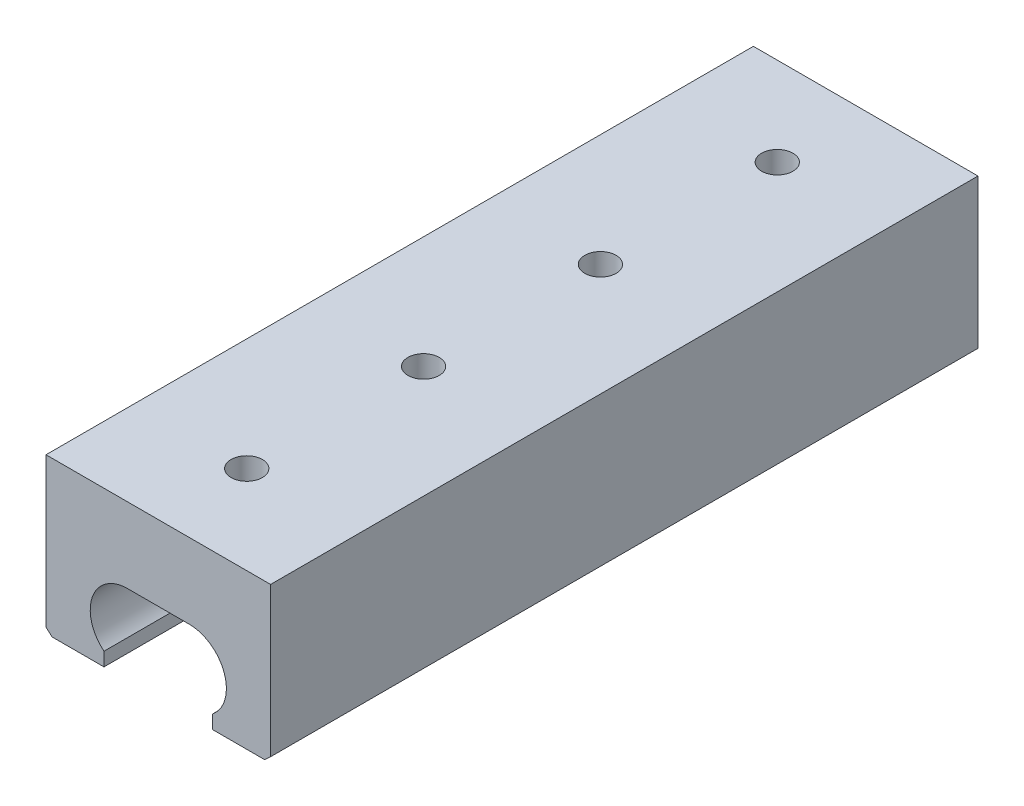
ISO-10303-21;
HEADER;
FILE_DESCRIPTION(('STEP AP214'),'2;1');
FILE_NAME('part.step','',(''),(''),'','','');
FILE_SCHEMA(('AUTOMOTIVE_DESIGN { 1 0 10303 214 1 1 1 1 }'));
ENDSEC;
DATA;
#1=APPLICATION_CONTEXT('core data for automotive mechanical design processes');
#2=APPLICATION_PROTOCOL_DEFINITION('international standard','automotive_design',2000,#1);
#3=PRODUCT_CONTEXT('',#1,'mechanical');
#4=PRODUCT('Part','Part','',(#3));
#5=PRODUCT_RELATED_PRODUCT_CATEGORY('part','',(#4));
#6=PRODUCT_DEFINITION_FORMATION('','',#4);
#7=PRODUCT_DEFINITION_CONTEXT('part definition',#1,'design');
#8=PRODUCT_DEFINITION('design','',#6,#7);
#9=PRODUCT_DEFINITION_SHAPE('','',#8);
#10=(LENGTH_UNIT() NAMED_UNIT(*) SI_UNIT(.MILLI.,.METRE.));
#11=(NAMED_UNIT(*) PLANE_ANGLE_UNIT() SI_UNIT($,.RADIAN.));
#12=(NAMED_UNIT(*) SI_UNIT($,.STERADIAN.) SOLID_ANGLE_UNIT());
#13=UNCERTAINTY_MEASURE_WITH_UNIT(LENGTH_MEASURE(1.E-05),#10,'distance_accuracy_value','');
#14=(GEOMETRIC_REPRESENTATION_CONTEXT(3) GLOBAL_UNCERTAINTY_ASSIGNED_CONTEXT((#13)) GLOBAL_UNIT_ASSIGNED_CONTEXT((#10,
#11,#12)) REPRESENTATION_CONTEXT('',''));
#15=CARTESIAN_POINT('',(0.,0.,0.));
#16=DIRECTION('',(0.,0.,1.));
#17=DIRECTION('',(1.,0.,0.));
#18=AXIS2_PLACEMENT_3D('',#15,#16,#17);
#19=CARTESIAN_POINT('',(-68.5063828996091,11.5130335390309,203.2));
#20=DIRECTION('',(1.,0.,0.));
#21=DIRECTION('',(0.,0.,-1.));
#22=AXIS2_PLACEMENT_3D('',#19,#20,#21);
#23=PLANE('',#22);
#24=DIRECTION('',(0.,-1.,0.));
#25=VECTOR('',#24,1.);
#26=CARTESIAN_POINT('',(-68.5063828996091,11.5130335390309,0.));
#27=LINE('',#26,#25);
#28=CARTESIAN_POINT('',(-68.5063828996091,11.5130335390309,0.));
#29=VERTEX_POINT('',#28);
#30=CARTESIAN_POINT('',(-68.5063828996091,-31.3555147627907,0.));
#31=VERTEX_POINT('',#30);
#32=EDGE_CURVE('E171',#29,#31,#27,.T.);
#33=ORIENTED_EDGE('',*,*,#32,.T.);
#34=DIRECTION('',(0.,0.,-1.));
#35=VECTOR('',#34,1.);
#36=CARTESIAN_POINT('',(-68.5063828996091,-31.3555147627907,203.2));
#37=LINE('',#36,#35);
#38=CARTESIAN_POINT('',(-68.5063828996091,-31.3555147627907,203.2));
#39=VERTEX_POINT('',#38);
#40=EDGE_CURVE('E237',#39,#31,#37,.T.);
#41=ORIENTED_EDGE('',*,*,#40,.F.);
#42=DIRECTION('',(0.,-1.,0.));
#43=VECTOR('',#42,1.);
#44=CARTESIAN_POINT('',(-68.5063828996091,11.5130335390309,203.2));
#45=LINE('',#44,#43);
#46=CARTESIAN_POINT('',(-68.5063828996091,11.5130335390309,203.2));
#47=VERTEX_POINT('',#46);
#48=EDGE_CURVE('E204',#47,#39,#45,.T.);
#49=ORIENTED_EDGE('',*,*,#48,.F.);
#50=DIRECTION('',(0.,0.,-1.));
#51=VECTOR('',#50,1.);
#52=CARTESIAN_POINT('',(-68.5063828996091,11.5130335390309,203.2));
#53=LINE('',#52,#51);
#54=EDGE_CURVE('E170',#47,#29,#53,.T.);
#55=ORIENTED_EDGE('',*,*,#54,.T.);
#56=EDGE_LOOP('',(#33,#41,#49,#55));
#57=FACE_BOUND('',#56,.T.);
#58=ADVANCED_FACE('F41',(#57),#23,.F.);
#59=CARTESIAN_POINT('',(-68.5063828996091,-31.3555147627907,203.2));
#60=DIRECTION('',(0.679560356484189,0.733619602992643,0.));
#61=DIRECTION('',(-0.733619602992643,0.679560356484189,0.));
#62=AXIS2_PLACEMENT_3D('',#59,#60,#61);
#63=PLANE('',#62);
#64=DIRECTION('',(0.733619602992643,-0.679560356484189,0.));
#65=VECTOR('',#64,1.);
#66=CARTESIAN_POINT('',(-68.5063828996091,-31.3555147627907,0.));
#67=LINE('',#66,#65);
#68=CARTESIAN_POINT('',(-66.7991262065142,-32.9369664609691,0.));
#69=VERTEX_POINT('',#68);
#70=EDGE_CURVE('E174',#31,#69,#67,.T.);
#71=ORIENTED_EDGE('',*,*,#70,.T.);
#72=DIRECTION('',(0.,0.,-1.));
#73=VECTOR('',#72,1.);
#74=CARTESIAN_POINT('',(-66.7991262065142,-32.9369664609691,203.2));
#75=LINE('',#74,#73);
#76=CARTESIAN_POINT('',(-66.7991262065142,-32.9369664609691,203.2));
#77=VERTEX_POINT('',#76);
#78=EDGE_CURVE('E232',#77,#69,#75,.T.);
#79=ORIENTED_EDGE('',*,*,#78,.F.);
#80=DIRECTION('',(0.733619602992643,-0.679560356484189,0.));
#81=VECTOR('',#80,1.);
#82=CARTESIAN_POINT('',(-68.5063828996091,-31.3555147627907,203.2));
#83=LINE('',#82,#81);
#84=EDGE_CURVE('E114',#39,#77,#83,.T.);
#85=ORIENTED_EDGE('',*,*,#84,.F.);
#86=ORIENTED_EDGE('',*,*,#40,.T.);
#87=EDGE_LOOP('',(#71,#79,#85,#86));
#88=FACE_BOUND('',#87,.T.);
#89=ADVANCED_FACE('F271',(#88),#63,.F.);
#90=CARTESIAN_POINT('',(-51.8484095418568,-32.9369664609691,203.2));
#91=DIRECTION('',(0.,1.,0.));
#92=DIRECTION('',(0.,0.,1.));
#93=AXIS2_PLACEMENT_3D('',#90,#91,#92);
#94=PLANE('',#93);
#95=DIRECTION('',(1.,0.,0.));
#96=VECTOR('',#95,1.);
#97=CARTESIAN_POINT('',(-51.8484095418568,-32.9369664609691,0.));
#98=LINE('',#97,#96);
#99=CARTESIAN_POINT('',(-51.8484095418568,-32.9369664609691,0.));
#100=VERTEX_POINT('',#99);
#101=EDGE_CURVE('E177',#69,#100,#98,.T.);
#102=ORIENTED_EDGE('',*,*,#101,.T.);
#103=DIRECTION('',(0.,0.,-1.));
#104=VECTOR('',#103,1.);
#105=CARTESIAN_POINT('',(-51.8484095418568,-32.9369664609691,203.2));
#106=LINE('',#105,#104);
#107=CARTESIAN_POINT('',(-51.8484095418568,-32.9369664609691,203.2));
#108=VERTEX_POINT('',#107);
#109=EDGE_CURVE('E233',#108,#100,#106,.T.);
#110=ORIENTED_EDGE('',*,*,#109,.F.);
#111=DIRECTION('',(1.,0.,0.));
#112=VECTOR('',#111,1.);
#113=CARTESIAN_POINT('',(-51.8484095418568,-32.9369664609691,203.2));
#114=LINE('',#113,#112);
#115=EDGE_CURVE('E386',#77,#108,#114,.T.);
#116=ORIENTED_EDGE('',*,*,#115,.F.);
#117=ORIENTED_EDGE('',*,*,#78,.T.);
#118=EDGE_LOOP('',(#102,#110,#116,#117));
#119=FACE_BOUND('',#118,.T.);
#120=ADVANCED_FACE('F278',(#119),#94,.F.);
#121=CARTESIAN_POINT('',(-51.8484095418568,-29.0298593773015,203.2));
#122=DIRECTION('',(-1.,0.,0.));
#123=DIRECTION('',(0.,-1.,0.));
#124=AXIS2_PLACEMENT_3D('',#121,#122,#123);
#125=PLANE('',#124);
#126=DIRECTION('',(0.,1.,0.));
#127=VECTOR('',#126,1.);
#128=CARTESIAN_POINT('',(-51.8484095418568,-29.0298593773015,0.));
#129=LINE('',#128,#127);
#130=CARTESIAN_POINT('',(-51.8484095418568,-29.0298593773015,0.));
#131=VERTEX_POINT('',#130);
#132=EDGE_CURVE('E185',#100,#131,#129,.T.);
#133=ORIENTED_EDGE('',*,*,#132,.T.);
#134=DIRECTION('',(0.,0.,-1.));
#135=VECTOR('',#134,1.);
#136=CARTESIAN_POINT('',(-51.8484095418568,-29.0298593773015,203.2));
#137=LINE('',#136,#135);
#138=CARTESIAN_POINT('',(-51.8484095418568,-29.0298593773015,203.2));
#139=VERTEX_POINT('',#138);
#140=EDGE_CURVE('E227',#139,#131,#137,.T.);
#141=ORIENTED_EDGE('',*,*,#140,.F.);
#142=DIRECTION('',(0.,1.,0.));
#143=VECTOR('',#142,1.);
#144=CARTESIAN_POINT('',(-51.8484095418568,-29.0298593773015,203.2));
#145=LINE('',#144,#143);
#146=EDGE_CURVE('E333',#108,#139,#145,.T.);
#147=ORIENTED_EDGE('',*,*,#146,.F.);
#148=ORIENTED_EDGE('',*,*,#109,.T.);
#149=EDGE_LOOP('',(#133,#141,#147,#148));
#150=FACE_BOUND('',#149,.T.);
#151=ADVANCED_FACE('F311',(#150),#125,.F.);
#152=CARTESIAN_POINT('',(-45.1383828996091,-20.7363820330069,203.2));
#153=DIRECTION('',(0.,0.,-1.));
#154=DIRECTION('',(-1.,0.,0.));
#155=AXIS2_PLACEMENT_3D('',#152,#153,#154);
#156=CYLINDRICAL_SURFACE('',#155,10.668);
#157=CARTESIAN_POINT('',(-45.1383828996091,-20.7363820330069,0.));
#158=DIRECTION('',(0.,0.,-1.));
#159=DIRECTION('',(1.,0.,0.));
#160=AXIS2_PLACEMENT_3D('',#157,#158,#159);
#161=CIRCLE('',#160,10.668);
#162=CARTESIAN_POINT('',(-45.1383828996091,-10.068382033007,0.));
#163=VERTEX_POINT('',#162);
#164=EDGE_CURVE('E184',#131,#163,#161,.T.);
#165=ORIENTED_EDGE('',*,*,#164,.T.);
#166=DIRECTION('',(0.,0.,-1.));
#167=VECTOR('',#166,1.);
#168=CARTESIAN_POINT('',(-45.1383828996091,-10.068382033007,203.2));
#169=LINE('',#168,#167);
#170=CARTESIAN_POINT('',(-45.1383828996091,-10.068382033007,203.2));
#171=VERTEX_POINT('',#170);
#172=EDGE_CURVE('E221',#171,#163,#169,.T.);
#173=ORIENTED_EDGE('',*,*,#172,.F.);
#174=CARTESIAN_POINT('',(-45.1383828996091,-20.7363820330069,203.2));
#175=DIRECTION('',(0.,0.,-1.));
#176=DIRECTION('',(1.,0.,0.));
#177=AXIS2_PLACEMENT_3D('',#174,#175,#176);
#178=CIRCLE('',#177,10.668);
#179=EDGE_CURVE('E345',#139,#171,#178,.T.);
#180=ORIENTED_EDGE('',*,*,#179,.F.);
#181=ORIENTED_EDGE('',*,*,#140,.T.);
#182=EDGE_LOOP('',(#165,#173,#180,#181));
#183=FACE_BOUND('',#182,.T.);
#184=ADVANCED_FACE('F299',(#183),#156,.F.);
#185=CARTESIAN_POINT('',(-45.1383828996091,-10.068382033007,203.2));
#186=DIRECTION('',(0.,1.,0.));
#187=DIRECTION('',(-1.,0.,0.));
#188=AXIS2_PLACEMENT_3D('',#185,#186,#187);
#189=PLANE('',#188);
#190=CARTESIAN_POINT('',(-36.2483828996099,-10.068382033007,127.));
#191=DIRECTION('',(0.,1.,0.));
#192=DIRECTION('',(-1.,0.,0.));
#193=AXIS2_PLACEMENT_3D('',#190,#191,#192);
#194=CIRCLE('',#193,4.49999999999999);
#195=CARTESIAN_POINT('',(-40.7483828996098,-10.068382033007,127.));
#196=VERTEX_POINT('',#195);
#197=EDGE_CURVE('E413',#196,#196,#194,.T.);
#198=ORIENTED_EDGE('',*,*,#197,.T.);
#199=EDGE_LOOP('',(#198));
#200=FACE_BOUND('',#199,.T.);
#201=CARTESIAN_POINT('',(-36.2483828996099,-10.068382033007,177.8));
#202=DIRECTION('',(0.,1.,0.));
#203=DIRECTION('',(-1.,0.,0.));
#204=AXIS2_PLACEMENT_3D('',#201,#202,#203);
#205=CIRCLE('',#204,4.49999999999999);
#206=CARTESIAN_POINT('',(-40.7483828996098,-10.068382033007,177.8));
#207=VERTEX_POINT('',#206);
#208=EDGE_CURVE('E176',#207,#207,#205,.T.);
#209=ORIENTED_EDGE('',*,*,#208,.T.);
#210=EDGE_LOOP('',(#209));
#211=FACE_BOUND('',#210,.T.);
#212=DIRECTION('',(1.,0.,0.));
#213=VECTOR('',#212,1.);
#214=CARTESIAN_POINT('',(-45.1383828996091,-10.068382033007,0.));
#215=LINE('',#214,#213);
#216=CARTESIAN_POINT('',(-27.3583828996091,-10.068382033007,0.));
#217=VERTEX_POINT('',#216);
#218=EDGE_CURVE('E189',#163,#217,#215,.T.);
#219=ORIENTED_EDGE('',*,*,#218,.T.);
#220=DIRECTION('',(0.,0.,-1.));
#221=VECTOR('',#220,1.);
#222=CARTESIAN_POINT('',(-27.3583828996091,-10.068382033007,203.2));
#223=LINE('',#222,#221);
#224=CARTESIAN_POINT('',(-27.3583828996091,-10.068382033007,203.2));
#225=VERTEX_POINT('',#224);
#226=EDGE_CURVE('E218',#225,#217,#223,.T.);
#227=ORIENTED_EDGE('',*,*,#226,.F.);
#228=DIRECTION('',(1.,0.,0.));
#229=VECTOR('',#228,1.);
#230=CARTESIAN_POINT('',(-45.1383828996091,-10.068382033007,203.2));
#231=LINE('',#230,#229);
#232=EDGE_CURVE('E341',#171,#225,#231,.T.);
#233=ORIENTED_EDGE('',*,*,#232,.F.);
#234=ORIENTED_EDGE('',*,*,#172,.T.);
#235=EDGE_LOOP('',(#219,#227,#233,#234));
#236=FACE_BOUND('',#235,.T.);
#237=CARTESIAN_POINT('',(-36.2483828996099,-10.068382033007,76.2));
#238=DIRECTION('',(0.,1.,0.));
#239=DIRECTION('',(-1.,0.,0.));
#240=AXIS2_PLACEMENT_3D('',#237,#238,#239);
#241=CIRCLE('',#240,4.49999999999999);
#242=CARTESIAN_POINT('',(-40.7483828996098,-10.068382033007,76.2));
#243=VERTEX_POINT('',#242);
#244=EDGE_CURVE('E246',#243,#243,#241,.T.);
#245=ORIENTED_EDGE('',*,*,#244,.T.);
#246=EDGE_LOOP('',(#245));
#247=FACE_BOUND('',#246,.T.);
#248=CARTESIAN_POINT('',(-36.2483828996099,-10.068382033007,25.4));
#249=DIRECTION('',(0.,1.,0.));
#250=DIRECTION('',(-1.,0.,0.));
#251=AXIS2_PLACEMENT_3D('',#248,#249,#250);
#252=CIRCLE('',#251,4.49999999999999);
#253=CARTESIAN_POINT('',(-40.7483828996098,-10.068382033007,25.4));
#254=VERTEX_POINT('',#253);
#255=EDGE_CURVE('E11',#254,#254,#252,.T.);
#256=ORIENTED_EDGE('',*,*,#255,.T.);
#257=EDGE_LOOP('',(#256));
#258=FACE_BOUND('',#257,.T.);
#259=ADVANCED_FACE('F298',(#200,#211,#236,#247,#258),#189,.F.);
#260=CARTESIAN_POINT('',(-27.3583828996091,-20.7363820330069,203.2));
#261=DIRECTION('',(0.,0.,-1.));
#262=DIRECTION('',(-1.,0.,0.));
#263=AXIS2_PLACEMENT_3D('',#260,#261,#262);
#264=CYLINDRICAL_SURFACE('',#263,10.668);
#265=CARTESIAN_POINT('',(-27.3583828996091,-20.7363820330069,0.));
#266=DIRECTION('',(0.,0.,-1.));
#267=DIRECTION('',(-1.,0.,0.));
#268=AXIS2_PLACEMENT_3D('',#265,#266,#267);
#269=CIRCLE('',#268,10.668);
#270=CARTESIAN_POINT('',(-20.6483562573615,-29.0298593773015,0.));
#271=VERTEX_POINT('',#270);
#272=EDGE_CURVE('E191',#217,#271,#269,.T.);
#273=ORIENTED_EDGE('',*,*,#272,.T.);
#274=DIRECTION('',(0.,0.,-1.));
#275=VECTOR('',#274,1.);
#276=CARTESIAN_POINT('',(-20.6483562573615,-29.0298593773015,203.2));
#277=LINE('',#276,#275);
#278=CARTESIAN_POINT('',(-20.6483562573615,-29.0298593773015,203.2));
#279=VERTEX_POINT('',#278);
#280=EDGE_CURVE('E215',#279,#271,#277,.T.);
#281=ORIENTED_EDGE('',*,*,#280,.F.);
#282=CARTESIAN_POINT('',(-27.3583828996091,-20.7363820330069,203.2));
#283=DIRECTION('',(0.,0.,-1.));
#284=DIRECTION('',(-1.,0.,0.));
#285=AXIS2_PLACEMENT_3D('',#282,#283,#284);
#286=CIRCLE('',#285,10.668);
#287=EDGE_CURVE('E343',#225,#279,#286,.T.);
#288=ORIENTED_EDGE('',*,*,#287,.F.);
#289=ORIENTED_EDGE('',*,*,#226,.T.);
#290=EDGE_LOOP('',(#273,#281,#288,#289));
#291=FACE_BOUND('',#290,.T.);
#292=ADVANCED_FACE('F296',(#291),#264,.F.);
#293=CARTESIAN_POINT('',(-20.6483562573615,-29.0298593773015,203.2));
#294=DIRECTION('',(1.,0.,0.));
#295=DIRECTION('',(0.,1.,0.));
#296=AXIS2_PLACEMENT_3D('',#293,#294,#295);
#297=PLANE('',#296);
#298=DIRECTION('',(0.,-1.,0.));
#299=VECTOR('',#298,1.);
#300=CARTESIAN_POINT('',(-20.6483562573615,-29.0298593773015,0.));
#301=LINE('',#300,#299);
#302=CARTESIAN_POINT('',(-20.6483562573614,-32.9369664609691,0.));
#303=VERTEX_POINT('',#302);
#304=EDGE_CURVE('E193',#271,#303,#301,.T.);
#305=ORIENTED_EDGE('',*,*,#304,.T.);
#306=DIRECTION('',(0.,0.,-1.));
#307=VECTOR('',#306,1.);
#308=CARTESIAN_POINT('',(-20.6483562573614,-32.9369664609691,203.2));
#309=LINE('',#308,#307);
#310=CARTESIAN_POINT('',(-20.6483562573614,-32.9369664609691,203.2));
#311=VERTEX_POINT('',#310);
#312=EDGE_CURVE('E211',#311,#303,#309,.T.);
#313=ORIENTED_EDGE('',*,*,#312,.F.);
#314=DIRECTION('',(0.,-1.,0.));
#315=VECTOR('',#314,1.);
#316=CARTESIAN_POINT('',(-20.6483562573615,-29.0298593773015,203.2));
#317=LINE('',#316,#315);
#318=EDGE_CURVE('E348',#279,#311,#317,.T.);
#319=ORIENTED_EDGE('',*,*,#318,.F.);
#320=ORIENTED_EDGE('',*,*,#280,.T.);
#321=EDGE_LOOP('',(#305,#313,#319,#320));
#322=FACE_BOUND('',#321,.T.);
#323=ADVANCED_FACE('F310',(#322),#297,.F.);
#324=CARTESIAN_POINT('',(-20.6483562573614,-32.9369664609691,203.2));
#325=DIRECTION('',(0.,1.,0.));
#326=DIRECTION('',(-1.,0.,0.));
#327=AXIS2_PLACEMENT_3D('',#324,#325,#326);
#328=PLANE('',#327);
#329=DIRECTION('',(1.,0.,0.));
#330=VECTOR('',#329,1.);
#331=CARTESIAN_POINT('',(-20.6483562573614,-32.9369664609691,0.));
#332=LINE('',#331,#330);
#333=CARTESIAN_POINT('',(-5.69763959270406,-32.9369664609691,0.));
#334=VERTEX_POINT('',#333);
#335=EDGE_CURVE('E200',#303,#334,#332,.T.);
#336=ORIENTED_EDGE('',*,*,#335,.T.);
#337=DIRECTION('',(0.,0.,-1.));
#338=VECTOR('',#337,1.);
#339=CARTESIAN_POINT('',(-5.69763959270406,-32.9369664609691,203.2));
#340=LINE('',#339,#338);
#341=CARTESIAN_POINT('',(-5.69763959270406,-32.9369664609691,203.2));
#342=VERTEX_POINT('',#341);
#343=EDGE_CURVE('E160',#342,#334,#340,.T.);
#344=ORIENTED_EDGE('',*,*,#343,.F.);
#345=DIRECTION('',(1.,0.,0.));
#346=VECTOR('',#345,1.);
#347=CARTESIAN_POINT('',(-20.6483562573614,-32.9369664609691,203.2));
#348=LINE('',#347,#346);
#349=EDGE_CURVE('E146',#311,#342,#348,.T.);
#350=ORIENTED_EDGE('',*,*,#349,.F.);
#351=ORIENTED_EDGE('',*,*,#312,.T.);
#352=EDGE_LOOP('',(#336,#344,#350,#351));
#353=FACE_BOUND('',#352,.T.);
#354=ADVANCED_FACE('F377',(#353),#328,.F.);
#355=CARTESIAN_POINT('',(-3.9903828996091,-31.3555147627907,203.2));
#356=DIRECTION('',(-0.679560356484187,0.733619602992644,0.));
#357=DIRECTION('',(-0.733619602992644,-0.679560356484187,0.));
#358=AXIS2_PLACEMENT_3D('',#355,#356,#357);
#359=PLANE('',#358);
#360=DIRECTION('',(0.733619602992644,0.679560356484187,0.));
#361=VECTOR('',#360,1.);
#362=CARTESIAN_POINT('',(-3.9903828996091,-31.3555147627907,0.));
#363=LINE('',#362,#361);
#364=CARTESIAN_POINT('',(-3.9903828996091,-31.3555147627907,0.));
#365=VERTEX_POINT('',#364);
#366=EDGE_CURVE('E154',#334,#365,#363,.T.);
#367=ORIENTED_EDGE('',*,*,#366,.T.);
#368=DIRECTION('',(0.,0.,-1.));
#369=VECTOR('',#368,1.);
#370=CARTESIAN_POINT('',(-3.9903828996091,-31.3555147627907,203.2));
#371=LINE('',#370,#369);
#372=CARTESIAN_POINT('',(-3.9903828996091,-31.3555147627907,203.2));
#373=VERTEX_POINT('',#372);
#374=EDGE_CURVE('E155',#373,#365,#371,.T.);
#375=ORIENTED_EDGE('',*,*,#374,.F.);
#376=DIRECTION('',(0.733619602992644,0.679560356484187,0.));
#377=VECTOR('',#376,1.);
#378=CARTESIAN_POINT('',(-3.9903828996091,-31.3555147627907,203.2));
#379=LINE('',#378,#377);
#380=EDGE_CURVE('E139',#342,#373,#379,.T.);
#381=ORIENTED_EDGE('',*,*,#380,.F.);
#382=ORIENTED_EDGE('',*,*,#343,.T.);
#383=EDGE_LOOP('',(#367,#375,#381,#382));
#384=FACE_BOUND('',#383,.T.);
#385=ADVANCED_FACE('F152',(#384),#359,.F.);
#386=CARTESIAN_POINT('',(-3.99038289960914,11.5130335390309,203.2));
#387=DIRECTION('',(-1.,0.,0.));
#388=DIRECTION('',(0.,-1.,0.));
#389=AXIS2_PLACEMENT_3D('',#386,#387,#388);
#390=PLANE('',#389);
#391=DIRECTION('',(0.,1.,0.));
#392=VECTOR('',#391,1.);
#393=CARTESIAN_POINT('',(-3.99038289960914,11.5130335390309,0.));
#394=LINE('',#393,#392);
#395=CARTESIAN_POINT('',(-3.99038289960914,11.5130335390309,0.));
#396=VERTEX_POINT('',#395);
#397=EDGE_CURVE('E99',#365,#396,#394,.T.);
#398=ORIENTED_EDGE('',*,*,#397,.T.);
#399=DIRECTION('',(0.,0.,-1.));
#400=VECTOR('',#399,1.);
#401=CARTESIAN_POINT('',(-3.99038289960914,11.5130335390309,203.2));
#402=LINE('',#401,#400);
#403=CARTESIAN_POINT('',(-3.99038289960914,11.5130335390309,203.2));
#404=VERTEX_POINT('',#403);
#405=EDGE_CURVE('E156',#404,#396,#402,.T.);
#406=ORIENTED_EDGE('',*,*,#405,.F.);
#407=DIRECTION('',(0.,1.,0.));
#408=VECTOR('',#407,1.);
#409=CARTESIAN_POINT('',(-3.99038289960914,11.5130335390309,203.2));
#410=LINE('',#409,#408);
#411=EDGE_CURVE('E144',#373,#404,#410,.T.);
#412=ORIENTED_EDGE('',*,*,#411,.F.);
#413=ORIENTED_EDGE('',*,*,#374,.T.);
#414=EDGE_LOOP('',(#398,#406,#412,#413));
#415=FACE_BOUND('',#414,.T.);
#416=ADVANCED_FACE('F159',(#415),#390,.F.);
#417=CARTESIAN_POINT('',(-68.5063828996091,11.5130335390309,203.2));
#418=DIRECTION('',(0.,-1.,0.));
#419=DIRECTION('',(1.,0.,0.));
#420=AXIS2_PLACEMENT_3D('',#417,#418,#419);
#421=PLANE('',#420);
#422=CARTESIAN_POINT('',(-36.2483828996099,11.5130335390309,127.));
#423=DIRECTION('',(0.,1.,0.));
#424=DIRECTION('',(0.,0.,1.));
#425=AXIS2_PLACEMENT_3D('',#422,#423,#424);
#426=CIRCLE('',#425,4.5);
#427=CARTESIAN_POINT('',(-36.2483828996099,11.5130335390309,131.5));
#428=VERTEX_POINT('',#427);
#429=EDGE_CURVE('E420',#428,#428,#426,.T.);
#430=ORIENTED_EDGE('',*,*,#429,.F.);
#431=EDGE_LOOP('',(#430));
#432=FACE_BOUND('',#431,.T.);
#433=CARTESIAN_POINT('',(-36.2483828996099,11.5130335390309,177.8));
#434=DIRECTION('',(0.,1.,0.));
#435=DIRECTION('',(0.,0.,1.));
#436=AXIS2_PLACEMENT_3D('',#433,#434,#435);
#437=CIRCLE('',#436,4.5);
#438=CARTESIAN_POINT('',(-36.2483828996099,11.5130335390309,182.3));
#439=VERTEX_POINT('',#438);
#440=EDGE_CURVE('E410',#439,#439,#437,.T.);
#441=ORIENTED_EDGE('',*,*,#440,.F.);
#442=EDGE_LOOP('',(#441));
#443=FACE_BOUND('',#442,.T.);
#444=DIRECTION('',(-1.,0.,0.));
#445=VECTOR('',#444,1.);
#446=CARTESIAN_POINT('',(-68.5063828996091,11.5130335390309,0.));
#447=LINE('',#446,#445);
#448=EDGE_CURVE('E106',#396,#29,#447,.T.);
#449=ORIENTED_EDGE('',*,*,#448,.T.);
#450=ORIENTED_EDGE('',*,*,#54,.F.);
#451=DIRECTION('',(-1.,0.,0.));
#452=VECTOR('',#451,1.);
#453=CARTESIAN_POINT('',(-68.5063828996091,11.5130335390309,203.2));
#454=LINE('',#453,#452);
#455=EDGE_CURVE('E56',#404,#47,#454,.T.);
#456=ORIENTED_EDGE('',*,*,#455,.F.);
#457=ORIENTED_EDGE('',*,*,#405,.T.);
#458=EDGE_LOOP('',(#449,#450,#456,#457));
#459=FACE_BOUND('',#458,.T.);
#460=CARTESIAN_POINT('',(-36.2483828996099,11.5130335390309,76.2));
#461=DIRECTION('',(0.,1.,0.));
#462=DIRECTION('',(0.,0.,1.));
#463=AXIS2_PLACEMENT_3D('',#460,#461,#462);
#464=CIRCLE('',#463,4.5);
#465=CARTESIAN_POINT('',(-36.2483828996099,11.5130335390309,80.7));
#466=VERTEX_POINT('',#465);
#467=EDGE_CURVE('E245',#466,#466,#464,.T.);
#468=ORIENTED_EDGE('',*,*,#467,.F.);
#469=EDGE_LOOP('',(#468));
#470=FACE_BOUND('',#469,.T.);
#471=CARTESIAN_POINT('',(-36.2483828996099,11.5130335390309,25.4));
#472=DIRECTION('',(0.,1.,0.));
#473=DIRECTION('',(0.,0.,1.));
#474=AXIS2_PLACEMENT_3D('',#471,#472,#473);
#475=CIRCLE('',#474,4.5);
#476=CARTESIAN_POINT('',(-36.2483828996099,11.5130335390309,29.9));
#477=VERTEX_POINT('',#476);
#478=EDGE_CURVE('E51',#477,#477,#475,.T.);
#479=ORIENTED_EDGE('',*,*,#478,.F.);
#480=EDGE_LOOP('',(#479));
#481=FACE_BOUND('',#480,.T.);
#482=ADVANCED_FACE('F256',(#432,#443,#459,#470,#481),#421,.F.);
#483=CARTESIAN_POINT('',(-45.1383828996091,-20.7363820330069,203.2));
#484=DIRECTION('',(0.,0.,1.));
#485=DIRECTION('',(1.,0.,0.));
#486=AXIS2_PLACEMENT_3D('',#483,#484,#485);
#487=PLANE('',#486);
#488=ORIENTED_EDGE('',*,*,#48,.T.);
#489=ORIENTED_EDGE('',*,*,#84,.T.);
#490=ORIENTED_EDGE('',*,*,#115,.T.);
#491=ORIENTED_EDGE('',*,*,#146,.T.);
#492=ORIENTED_EDGE('',*,*,#179,.T.);
#493=ORIENTED_EDGE('',*,*,#232,.T.);
#494=ORIENTED_EDGE('',*,*,#287,.T.);
#495=ORIENTED_EDGE('',*,*,#318,.T.);
#496=ORIENTED_EDGE('',*,*,#349,.T.);
#497=ORIENTED_EDGE('',*,*,#380,.T.);
#498=ORIENTED_EDGE('',*,*,#411,.T.);
#499=ORIENTED_EDGE('',*,*,#455,.T.);
#500=EDGE_LOOP('',(#488,#489,#490,#491,#492,#493,#494,#495,#496,#497,#498,#499));
#501=FACE_BOUND('',#500,.T.);
#502=ADVANCED_FACE('F145',(#501),#487,.T.);
#503=CARTESIAN_POINT('',(-45.1383828996091,-20.7363820330069,0.));
#504=DIRECTION('',(0.,0.,1.));
#505=DIRECTION('',(1.,0.,0.));
#506=AXIS2_PLACEMENT_3D('',#503,#504,#505);
#507=PLANE('',#506);
#508=ORIENTED_EDGE('',*,*,#32,.F.);
#509=ORIENTED_EDGE('',*,*,#448,.F.);
#510=ORIENTED_EDGE('',*,*,#397,.F.);
#511=ORIENTED_EDGE('',*,*,#366,.F.);
#512=ORIENTED_EDGE('',*,*,#335,.F.);
#513=ORIENTED_EDGE('',*,*,#304,.F.);
#514=ORIENTED_EDGE('',*,*,#272,.F.);
#515=ORIENTED_EDGE('',*,*,#218,.F.);
#516=ORIENTED_EDGE('',*,*,#164,.F.);
#517=ORIENTED_EDGE('',*,*,#132,.F.);
#518=ORIENTED_EDGE('',*,*,#101,.F.);
#519=ORIENTED_EDGE('',*,*,#70,.F.);
#520=EDGE_LOOP('',(#508,#509,#510,#511,#512,#513,#514,#515,#516,#517,#518,#519));
#521=FACE_BOUND('',#520,.T.);
#522=ADVANCED_FACE('F264',(#521),#507,.F.);
#523=CARTESIAN_POINT('',(-36.2483828996099,11.5130335390309,177.8));
#524=DIRECTION('',(0.,1.,0.));
#525=DIRECTION('',(0.,0.,1.));
#526=AXIS2_PLACEMENT_3D('',#523,#524,#525);
#527=CYLINDRICAL_SURFACE('',#526,4.49999999999999);
#528=ORIENTED_EDGE('',*,*,#440,.T.);
#529=EDGE_LOOP('',(#528));
#530=FACE_BOUND('',#529,.T.);
#531=ORIENTED_EDGE('',*,*,#208,.F.);
#532=EDGE_LOOP('',(#531));
#533=FACE_BOUND('',#532,.T.);
#534=ADVANCED_FACE('F287',(#530,#533),#527,.F.);
#535=CARTESIAN_POINT('',(-36.2483828996099,11.5130335390309,127.));
#536=DIRECTION('',(0.,1.,0.));
#537=DIRECTION('',(0.,0.,1.));
#538=AXIS2_PLACEMENT_3D('',#535,#536,#537);
#539=CYLINDRICAL_SURFACE('',#538,4.49999999999999);
#540=ORIENTED_EDGE('',*,*,#429,.T.);
#541=EDGE_LOOP('',(#540));
#542=FACE_BOUND('',#541,.T.);
#543=ORIENTED_EDGE('',*,*,#197,.F.);
#544=EDGE_LOOP('',(#543));
#545=FACE_BOUND('',#544,.T.);
#546=ADVANCED_FACE('F283',(#542,#545),#539,.F.);
#547=CARTESIAN_POINT('',(-36.2483828996099,11.5130335390309,76.2));
#548=DIRECTION('',(0.,1.,0.));
#549=DIRECTION('',(0.,0.,1.));
#550=AXIS2_PLACEMENT_3D('',#547,#548,#549);
#551=CYLINDRICAL_SURFACE('',#550,4.49999999999999);
#552=ORIENTED_EDGE('',*,*,#467,.T.);
#553=EDGE_LOOP('',(#552));
#554=FACE_BOUND('',#553,.T.);
#555=ORIENTED_EDGE('',*,*,#244,.F.);
#556=EDGE_LOOP('',(#555));
#557=FACE_BOUND('',#556,.T.);
#558=ADVANCED_FACE('F285',(#554,#557),#551,.F.);
#559=CARTESIAN_POINT('',(-36.2483828996099,11.5130335390309,25.4));
#560=DIRECTION('',(0.,1.,0.));
#561=DIRECTION('',(0.,0.,1.));
#562=AXIS2_PLACEMENT_3D('',#559,#560,#561);
#563=CYLINDRICAL_SURFACE('',#562,4.49999999999999);
#564=ORIENTED_EDGE('',*,*,#478,.T.);
#565=EDGE_LOOP('',(#564));
#566=FACE_BOUND('',#565,.T.);
#567=ORIENTED_EDGE('',*,*,#255,.F.);
#568=EDGE_LOOP('',(#567));
#569=FACE_BOUND('',#568,.T.);
#570=ADVANCED_FACE('F43',(#566,#569),#563,.F.);
#571=CLOSED_SHELL('',(#58,#89,#120,#151,#184,#259,#292,#323,#354,#385,#416,#482,#502,#522,#534,
#546,#558,#570));
#572=MANIFOLD_SOLID_BREP('B2',#571);
#573=ADVANCED_BREP_SHAPE_REPRESENTATION('',(#18,#572),#14);
#574=SHAPE_DEFINITION_REPRESENTATION(#9,#573);
ENDSEC;
END-ISO-10303-21;
